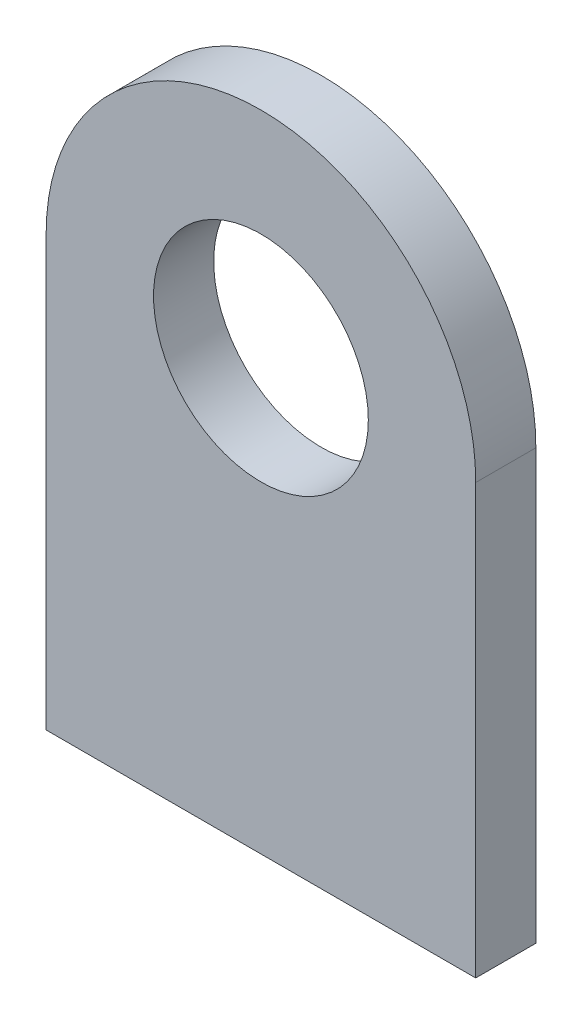
ISO-10303-21;
HEADER;
FILE_DESCRIPTION(('STEP AP214'),'2;1');
FILE_NAME('part.step','',(''),(''),'','','');
FILE_SCHEMA(('AUTOMOTIVE_DESIGN { 1 0 10303 214 1 1 1 1 }'));
ENDSEC;
DATA;
#1=APPLICATION_CONTEXT('core data for automotive mechanical design processes');
#2=APPLICATION_PROTOCOL_DEFINITION('international standard','automotive_design',2000,#1);
#3=PRODUCT_CONTEXT('',#1,'mechanical');
#4=PRODUCT('Part','Part','',(#3));
#5=PRODUCT_RELATED_PRODUCT_CATEGORY('part','',(#4));
#6=PRODUCT_DEFINITION_FORMATION('','',#4);
#7=PRODUCT_DEFINITION_CONTEXT('part definition',#1,'design');
#8=PRODUCT_DEFINITION('design','',#6,#7);
#9=PRODUCT_DEFINITION_SHAPE('','',#8);
#10=(LENGTH_UNIT() NAMED_UNIT(*) SI_UNIT(.MILLI.,.METRE.));
#11=(NAMED_UNIT(*) PLANE_ANGLE_UNIT() SI_UNIT($,.RADIAN.));
#12=(NAMED_UNIT(*) SI_UNIT($,.STERADIAN.) SOLID_ANGLE_UNIT());
#13=UNCERTAINTY_MEASURE_WITH_UNIT(LENGTH_MEASURE(1.E-05),#10,'distance_accuracy_value','');
#14=(GEOMETRIC_REPRESENTATION_CONTEXT(3) GLOBAL_UNCERTAINTY_ASSIGNED_CONTEXT((#13)) GLOBAL_UNIT_ASSIGNED_CONTEXT((#10,
#11,#12)) REPRESENTATION_CONTEXT('',''));
#15=CARTESIAN_POINT('',(0.,0.,0.));
#16=DIRECTION('',(0.,0.,1.));
#17=DIRECTION('',(1.,0.,0.));
#18=AXIS2_PLACEMENT_3D('',#15,#16,#17);
#19=CARTESIAN_POINT('',(-25.,0.,7.));
#20=DIRECTION('',(-1.,0.,0.));
#21=DIRECTION('',(0.,0.,1.));
#22=AXIS2_PLACEMENT_3D('',#19,#20,#21);
#23=PLANE('',#22);
#24=DIRECTION('',(0.,1.,0.));
#25=VECTOR('',#24,1.);
#26=CARTESIAN_POINT('',(-25.,0.,0.));
#27=LINE('',#26,#25);
#28=CARTESIAN_POINT('',(-25.,-50.,0.));
#29=VERTEX_POINT('',#28);
#30=CARTESIAN_POINT('',(-25.,0.0537741003007273,0.));
#31=VERTEX_POINT('',#30);
#32=EDGE_CURVE('E113',#29,#31,#27,.T.);
#33=ORIENTED_EDGE('',*,*,#32,.F.);
#34=DIRECTION('',(0.,0.,-1.));
#35=VECTOR('',#34,1.);
#36=CARTESIAN_POINT('',(-25.,-50.,7.));
#37=LINE('',#36,#35);
#38=CARTESIAN_POINT('',(-25.,-50.,7.));
#39=VERTEX_POINT('',#38);
#40=EDGE_CURVE('E11',#39,#29,#37,.T.);
#41=ORIENTED_EDGE('',*,*,#40,.F.);
#42=DIRECTION('',(0.,1.,0.));
#43=VECTOR('',#42,1.);
#44=CARTESIAN_POINT('',(-25.,0.,7.));
#45=LINE('',#44,#43);
#46=CARTESIAN_POINT('',(-25.,0.0537741003007273,7.));
#47=VERTEX_POINT('',#46);
#48=EDGE_CURVE('E93',#39,#47,#45,.T.);
#49=ORIENTED_EDGE('',*,*,#48,.T.);
#50=DIRECTION('',(0.,0.,-1.));
#51=VECTOR('',#50,1.);
#52=CARTESIAN_POINT('',(-25.,0.0537741003007273,7.));
#53=LINE('',#52,#51);
#54=EDGE_CURVE('E81',#47,#31,#53,.T.);
#55=ORIENTED_EDGE('',*,*,#54,.T.);
#56=EDGE_LOOP('',(#33,#41,#49,#55));
#57=FACE_BOUND('',#56,.T.);
#58=ADVANCED_FACE('F41',(#57),#23,.T.);
#59=CARTESIAN_POINT('',(0.,-50.,7.));
#60=DIRECTION('',(0.,1.,0.));
#61=DIRECTION('',(-1.,0.,0.));
#62=AXIS2_PLACEMENT_3D('',#59,#60,#61);
#63=PLANE('',#62);
#64=DIRECTION('',(1.,0.,0.));
#65=VECTOR('',#64,1.);
#66=CARTESIAN_POINT('',(0.,-50.,0.));
#67=LINE('',#66,#65);
#68=CARTESIAN_POINT('',(25.,-50.,0.));
#69=VERTEX_POINT('',#68);
#70=EDGE_CURVE('E99',#29,#69,#67,.T.);
#71=ORIENTED_EDGE('',*,*,#70,.T.);
#72=DIRECTION('',(0.,0.,-1.));
#73=VECTOR('',#72,1.);
#74=CARTESIAN_POINT('',(25.,-50.,7.));
#75=LINE('',#74,#73);
#76=CARTESIAN_POINT('',(25.,-50.,7.));
#77=VERTEX_POINT('',#76);
#78=EDGE_CURVE('E50',#77,#69,#75,.T.);
#79=ORIENTED_EDGE('',*,*,#78,.F.);
#80=DIRECTION('',(1.,0.,0.));
#81=VECTOR('',#80,1.);
#82=CARTESIAN_POINT('',(0.,-50.,7.));
#83=LINE('',#82,#81);
#84=EDGE_CURVE('E87',#39,#77,#83,.T.);
#85=ORIENTED_EDGE('',*,*,#84,.F.);
#86=ORIENTED_EDGE('',*,*,#40,.T.);
#87=EDGE_LOOP('',(#71,#79,#85,#86));
#88=FACE_BOUND('',#87,.T.);
#89=ADVANCED_FACE('F97',(#88),#63,.F.);
#90=CARTESIAN_POINT('',(25.,0.,7.));
#91=DIRECTION('',(-1.,0.,0.));
#92=DIRECTION('',(0.,0.,1.));
#93=AXIS2_PLACEMENT_3D('',#90,#91,#92);
#94=PLANE('',#93);
#95=DIRECTION('',(0.,1.,0.));
#96=VECTOR('',#95,1.);
#97=CARTESIAN_POINT('',(25.,0.,0.));
#98=LINE('',#97,#96);
#99=CARTESIAN_POINT('',(25.,-0.0537741002944278,0.));
#100=VERTEX_POINT('',#99);
#101=EDGE_CURVE('E74',#69,#100,#98,.T.);
#102=ORIENTED_EDGE('',*,*,#101,.T.);
#103=DIRECTION('',(0.,0.,-1.));
#104=VECTOR('',#103,1.);
#105=CARTESIAN_POINT('',(25.,-0.0537741002944278,7.));
#106=LINE('',#105,#104);
#107=CARTESIAN_POINT('',(25.,-0.0537741002944278,7.));
#108=VERTEX_POINT('',#107);
#109=EDGE_CURVE('E101',#108,#100,#106,.T.);
#110=ORIENTED_EDGE('',*,*,#109,.F.);
#111=DIRECTION('',(0.,1.,0.));
#112=VECTOR('',#111,1.);
#113=CARTESIAN_POINT('',(25.,0.,7.));
#114=LINE('',#113,#112);
#115=EDGE_CURVE('E92',#77,#108,#114,.T.);
#116=ORIENTED_EDGE('',*,*,#115,.F.);
#117=ORIENTED_EDGE('',*,*,#78,.T.);
#118=EDGE_LOOP('',(#102,#110,#116,#117));
#119=FACE_BOUND('',#118,.T.);
#120=ADVANCED_FACE('F102',(#119),#94,.F.);
#121=CARTESIAN_POINT('',(0.,0.,7.));
#122=DIRECTION('',(0.,0.,-1.));
#123=DIRECTION('',(-1.,0.,0.));
#124=AXIS2_PLACEMENT_3D('',#121,#122,#123);
#125=CYLINDRICAL_SURFACE('',#124,25.0000578330104);
#126=CARTESIAN_POINT('',(0.,0.,0.));
#127=DIRECTION('',(0.,0.,1.));
#128=DIRECTION('',(1.,0.,0.));
#129=AXIS2_PLACEMENT_3D('',#126,#127,#128);
#130=CIRCLE('',#129,25.0000578330104);
#131=EDGE_CURVE('E121',#100,#31,#130,.T.);
#132=ORIENTED_EDGE('',*,*,#131,.T.);
#133=ORIENTED_EDGE('',*,*,#54,.F.);
#134=CARTESIAN_POINT('',(0.,0.,7.));
#135=DIRECTION('',(0.,0.,1.));
#136=DIRECTION('',(1.,0.,0.));
#137=AXIS2_PLACEMENT_3D('',#134,#135,#136);
#138=CIRCLE('',#137,25.0000578330104);
#139=EDGE_CURVE('E58',#108,#47,#138,.T.);
#140=ORIENTED_EDGE('',*,*,#139,.F.);
#141=ORIENTED_EDGE('',*,*,#109,.T.);
#142=EDGE_LOOP('',(#132,#133,#140,#141));
#143=FACE_BOUND('',#142,.T.);
#144=ADVANCED_FACE('F133',(#143),#125,.T.);
#145=CARTESIAN_POINT('',(0.,0.,7.));
#146=DIRECTION('',(0.,0.,-1.));
#147=DIRECTION('',(-1.,0.,0.));
#148=AXIS2_PLACEMENT_3D('',#145,#146,#147);
#149=CYLINDRICAL_SURFACE('',#148,12.5);
#150=CARTESIAN_POINT('',(0.,0.,7.));
#151=DIRECTION('',(0.,0.,1.));
#152=DIRECTION('',(1.,0.,0.));
#153=AXIS2_PLACEMENT_3D('',#150,#151,#152);
#154=CIRCLE('',#153,12.5);
#155=CARTESIAN_POINT('',(12.5,0.,7.));
#156=VERTEX_POINT('',#155);
#157=EDGE_CURVE('E106',#156,#156,#154,.T.);
#158=ORIENTED_EDGE('',*,*,#157,.T.);
#159=EDGE_LOOP('',(#158));
#160=FACE_BOUND('',#159,.T.);
#161=CARTESIAN_POINT('',(0.,0.,0.));
#162=DIRECTION('',(0.,0.,1.));
#163=DIRECTION('',(1.,0.,0.));
#164=AXIS2_PLACEMENT_3D('',#161,#162,#163);
#165=CIRCLE('',#164,12.5);
#166=CARTESIAN_POINT('',(12.5,0.,0.));
#167=VERTEX_POINT('',#166);
#168=EDGE_CURVE('E124',#167,#167,#165,.T.);
#169=ORIENTED_EDGE('',*,*,#168,.F.);
#170=EDGE_LOOP('',(#169));
#171=FACE_BOUND('',#170,.T.);
#172=ADVANCED_FACE('F148',(#160,#171),#149,.F.);
#173=CARTESIAN_POINT('',(0.,0.,7.));
#174=DIRECTION('',(0.,0.,1.));
#175=DIRECTION('',(1.,0.,0.));
#176=AXIS2_PLACEMENT_3D('',#173,#174,#175);
#177=PLANE('',#176);
#178=ORIENTED_EDGE('',*,*,#48,.F.);
#179=ORIENTED_EDGE('',*,*,#84,.T.);
#180=ORIENTED_EDGE('',*,*,#115,.T.);
#181=ORIENTED_EDGE('',*,*,#139,.T.);
#182=EDGE_LOOP('',(#178,#179,#180,#181));
#183=FACE_BOUND('',#182,.T.);
#184=ORIENTED_EDGE('',*,*,#157,.F.);
#185=EDGE_LOOP('',(#184));
#186=FACE_BOUND('',#185,.T.);
#187=ADVANCED_FACE('F89',(#183,#186),#177,.T.);
#188=CARTESIAN_POINT('',(0.,0.,0.));
#189=DIRECTION('',(0.,0.,1.));
#190=DIRECTION('',(1.,0.,0.));
#191=AXIS2_PLACEMENT_3D('',#188,#189,#190);
#192=PLANE('',#191);
#193=ORIENTED_EDGE('',*,*,#32,.T.);
#194=ORIENTED_EDGE('',*,*,#131,.F.);
#195=ORIENTED_EDGE('',*,*,#101,.F.);
#196=ORIENTED_EDGE('',*,*,#70,.F.);
#197=EDGE_LOOP('',(#193,#194,#195,#196));
#198=FACE_BOUND('',#197,.T.);
#199=ORIENTED_EDGE('',*,*,#168,.T.);
#200=EDGE_LOOP('',(#199));
#201=FACE_BOUND('',#200,.T.);
#202=ADVANCED_FACE('F135',(#198,#201),#192,.F.);
#203=CLOSED_SHELL('',(#58,#89,#120,#144,#172,#187,#202));
#204=MANIFOLD_SOLID_BREP('B2',#203);
#205=ADVANCED_BREP_SHAPE_REPRESENTATION('',(#18,#204),#14);
#206=SHAPE_DEFINITION_REPRESENTATION(#9,#205);
ENDSEC;
END-ISO-10303-21;
